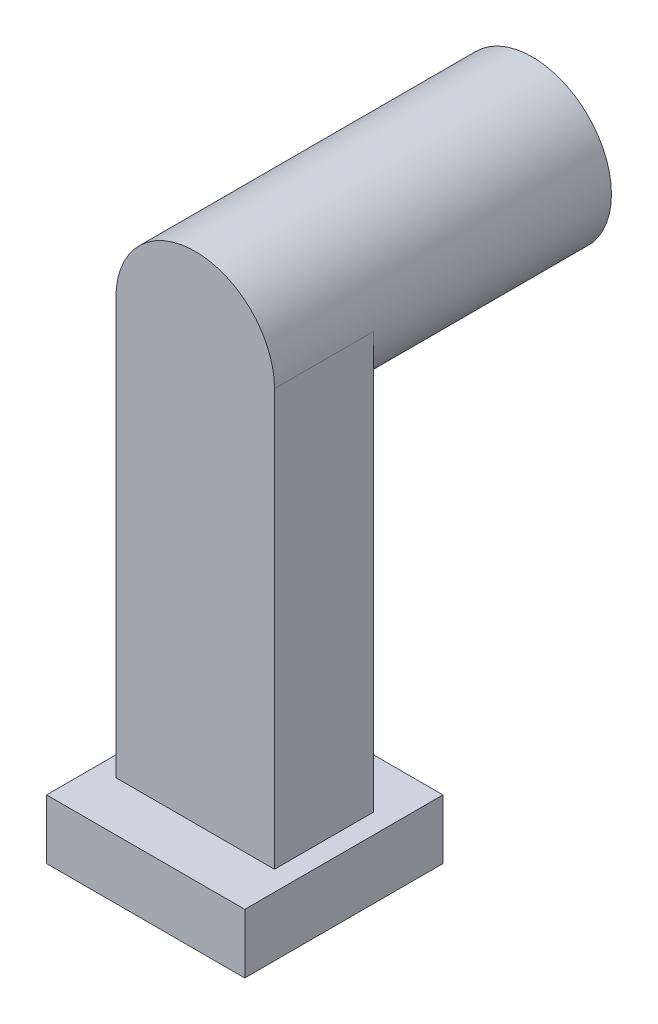
ISO-10303-21;
HEADER;
FILE_DESCRIPTION(('STEP AP214'),'2;1');
FILE_NAME('part.step','',(''),(''),'','','');
FILE_SCHEMA(('AUTOMOTIVE_DESIGN { 1 0 10303 214 1 1 1 1 }'));
ENDSEC;
DATA;
#1=APPLICATION_CONTEXT('core data for automotive mechanical design processes');
#2=APPLICATION_PROTOCOL_DEFINITION('international standard','automotive_design',2000,#1);
#3=PRODUCT_CONTEXT('',#1,'mechanical');
#4=PRODUCT('Part','Part','',(#3));
#5=PRODUCT_RELATED_PRODUCT_CATEGORY('part','',(#4));
#6=PRODUCT_DEFINITION_FORMATION('','',#4);
#7=PRODUCT_DEFINITION_CONTEXT('part definition',#1,'design');
#8=PRODUCT_DEFINITION('design','',#6,#7);
#9=PRODUCT_DEFINITION_SHAPE('','',#8);
#10=(LENGTH_UNIT() NAMED_UNIT(*) SI_UNIT(.MILLI.,.METRE.));
#11=(NAMED_UNIT(*) PLANE_ANGLE_UNIT() SI_UNIT($,.RADIAN.));
#12=(NAMED_UNIT(*) SI_UNIT($,.STERADIAN.) SOLID_ANGLE_UNIT());
#13=UNCERTAINTY_MEASURE_WITH_UNIT(LENGTH_MEASURE(1.E-05),#10,'distance_accuracy_value','');
#14=(GEOMETRIC_REPRESENTATION_CONTEXT(3) GLOBAL_UNCERTAINTY_ASSIGNED_CONTEXT((#13)) GLOBAL_UNIT_ASSIGNED_CONTEXT((#10,
#11,#12)) REPRESENTATION_CONTEXT('',''));
#15=CARTESIAN_POINT('',(0.,0.,0.));
#16=DIRECTION('',(0.,0.,1.));
#17=DIRECTION('',(1.,0.,0.));
#18=AXIS2_PLACEMENT_3D('',#15,#16,#17);
#19=CARTESIAN_POINT('',(0.,0.,30.));
#20=DIRECTION('',(0.,0.,-1.));
#21=DIRECTION('',(-1.,0.,0.));
#22=AXIS2_PLACEMENT_3D('',#19,#20,#21);
#23=CYLINDRICAL_SURFACE('',#22,4.);
#24=CARTESIAN_POINT('',(0.,0.,30.));
#25=DIRECTION('',(0.,0.,1.));
#26=DIRECTION('',(1.,0.,0.));
#27=AXIS2_PLACEMENT_3D('',#24,#25,#26);
#28=CIRCLE('',#27,4.);
#29=CARTESIAN_POINT('',(4.,0.,30.));
#30=VERTEX_POINT('',#29);
#31=CARTESIAN_POINT('',(-4.,0.,30.));
#32=VERTEX_POINT('',#31);
#33=EDGE_CURVE('E54',#30,#32,#28,.T.);
#34=ORIENTED_EDGE('',*,*,#33,.F.);
#35=DIRECTION('',(0.,0.,-1.));
#36=VECTOR('',#35,1.);
#37=CARTESIAN_POINT('',(4.,0.,25.));
#38=LINE('',#37,#36);
#39=CARTESIAN_POINT('',(4.,0.,25.));
#40=VERTEX_POINT('',#39);
#41=EDGE_CURVE('E96',#30,#40,#38,.T.);
#42=ORIENTED_EDGE('',*,*,#41,.T.);
#43=CARTESIAN_POINT('',(0.,0.,25.));
#44=DIRECTION('',(0.,0.,-1.));
#45=DIRECTION('',(-1.,0.,0.));
#46=AXIS2_PLACEMENT_3D('',#43,#44,#45);
#47=CIRCLE('',#46,4.);
#48=CARTESIAN_POINT('',(-4.,0.,25.));
#49=VERTEX_POINT('',#48);
#50=EDGE_CURVE('E11',#40,#49,#47,.T.);
#51=ORIENTED_EDGE('',*,*,#50,.T.);
#52=DIRECTION('',(0.,0.,1.));
#53=VECTOR('',#52,1.);
#54=CARTESIAN_POINT('',(-4.,0.,25.));
#55=LINE('',#54,#53);
#56=EDGE_CURVE('E105',#49,#32,#55,.T.);
#57=ORIENTED_EDGE('',*,*,#56,.T.);
#58=EDGE_LOOP('',(#34,#42,#51,#57));
#59=FACE_BOUND('',#58,.T.);
#60=CARTESIAN_POINT('',(0.,0.,13.));
#61=DIRECTION('',(0.,0.,1.));
#62=DIRECTION('',(1.,0.,0.));
#63=AXIS2_PLACEMENT_3D('',#60,#61,#62);
#64=CIRCLE('',#63,4.);
#65=CARTESIAN_POINT('',(4.,0.,13.));
#66=VERTEX_POINT('',#65);
#67=EDGE_CURVE('E116',#66,#66,#64,.T.);
#68=ORIENTED_EDGE('',*,*,#67,.T.);
#69=EDGE_LOOP('',(#68));
#70=FACE_BOUND('',#69,.T.);
#71=ADVANCED_FACE('F45',(#59,#70),#23,.T.);
#72=CARTESIAN_POINT('',(0.,0.,30.));
#73=DIRECTION('',(0.,0.,1.));
#74=DIRECTION('',(1.,0.,0.));
#75=AXIS2_PLACEMENT_3D('',#72,#73,#74);
#76=PLANE('',#75);
#77=ORIENTED_EDGE('',*,*,#33,.T.);
#78=DIRECTION('',(0.,1.,0.));
#79=VECTOR('',#78,1.);
#80=CARTESIAN_POINT('',(-4.,-21.,30.));
#81=LINE('',#80,#79);
#82=CARTESIAN_POINT('',(-4.,-21.,30.));
#83=VERTEX_POINT('',#82);
#84=EDGE_CURVE('E61',#83,#32,#81,.T.);
#85=ORIENTED_EDGE('',*,*,#84,.F.);
#86=DIRECTION('',(1.,0.,0.));
#87=VECTOR('',#86,1.);
#88=CARTESIAN_POINT('',(-4.,-21.,30.));
#89=LINE('',#88,#87);
#90=CARTESIAN_POINT('',(4.,-21.,30.));
#91=VERTEX_POINT('',#90);
#92=EDGE_CURVE('E109',#83,#91,#89,.T.);
#93=ORIENTED_EDGE('',*,*,#92,.T.);
#94=DIRECTION('',(0.,1.,0.));
#95=VECTOR('',#94,1.);
#96=CARTESIAN_POINT('',(4.,-21.,30.));
#97=LINE('',#96,#95);
#98=EDGE_CURVE('E99',#91,#30,#97,.T.);
#99=ORIENTED_EDGE('',*,*,#98,.T.);
#100=EDGE_LOOP('',(#77,#85,#93,#99));
#101=FACE_BOUND('',#100,.T.);
#102=ADVANCED_FACE('F130',(#101),#76,.T.);
#103=CARTESIAN_POINT('',(0.,0.,13.));
#104=DIRECTION('',(0.,0.,1.));
#105=DIRECTION('',(1.,0.,0.));
#106=AXIS2_PLACEMENT_3D('',#103,#104,#105);
#107=PLANE('',#106);
#108=ORIENTED_EDGE('',*,*,#67,.F.);
#109=EDGE_LOOP('',(#108));
#110=FACE_BOUND('',#109,.T.);
#111=ADVANCED_FACE('F47',(#110),#107,.F.);
#112=CARTESIAN_POINT('',(-4.,-21.,25.));
#113=DIRECTION('',(-1.,0.,0.));
#114=DIRECTION('',(0.,0.,1.));
#115=AXIS2_PLACEMENT_3D('',#112,#113,#114);
#116=PLANE('',#115);
#117=ORIENTED_EDGE('',*,*,#56,.F.);
#118=DIRECTION('',(0.,1.,0.));
#119=VECTOR('',#118,1.);
#120=CARTESIAN_POINT('',(-4.,-21.,25.));
#121=LINE('',#120,#119);
#122=CARTESIAN_POINT('',(-4.,-21.,25.));
#123=VERTEX_POINT('',#122);
#124=EDGE_CURVE('E90',#123,#49,#121,.T.);
#125=ORIENTED_EDGE('',*,*,#124,.F.);
#126=DIRECTION('',(0.,0.,1.));
#127=VECTOR('',#126,1.);
#128=CARTESIAN_POINT('',(-4.,-21.,25.));
#129=LINE('',#128,#127);
#130=EDGE_CURVE('E104',#123,#83,#129,.T.);
#131=ORIENTED_EDGE('',*,*,#130,.T.);
#132=ORIENTED_EDGE('',*,*,#84,.T.);
#133=EDGE_LOOP('',(#117,#125,#131,#132));
#134=FACE_BOUND('',#133,.T.);
#135=ADVANCED_FACE('F129',(#134),#116,.T.);
#136=CARTESIAN_POINT('',(-4.,-21.,25.));
#137=DIRECTION('',(0.,0.,-1.));
#138=DIRECTION('',(-1.,0.,0.));
#139=AXIS2_PLACEMENT_3D('',#136,#137,#138);
#140=PLANE('',#139);
#141=ORIENTED_EDGE('',*,*,#50,.F.);
#142=DIRECTION('',(0.,1.,0.));
#143=VECTOR('',#142,1.);
#144=CARTESIAN_POINT('',(4.,-21.,25.));
#145=LINE('',#144,#143);
#146=CARTESIAN_POINT('',(4.,-21.,25.));
#147=VERTEX_POINT('',#146);
#148=EDGE_CURVE('E88',#147,#40,#145,.T.);
#149=ORIENTED_EDGE('',*,*,#148,.F.);
#150=DIRECTION('',(-1.,0.,0.));
#151=VECTOR('',#150,1.);
#152=CARTESIAN_POINT('',(-4.,-21.,25.));
#153=LINE('',#152,#151);
#154=EDGE_CURVE('E122',#147,#123,#153,.T.);
#155=ORIENTED_EDGE('',*,*,#154,.T.);
#156=ORIENTED_EDGE('',*,*,#124,.T.);
#157=EDGE_LOOP('',(#141,#149,#155,#156));
#158=FACE_BOUND('',#157,.T.);
#159=ADVANCED_FACE('F85',(#158),#140,.T.);
#160=CARTESIAN_POINT('',(4.,-21.,25.));
#161=DIRECTION('',(1.,0.,0.));
#162=DIRECTION('',(0.,0.,-1.));
#163=AXIS2_PLACEMENT_3D('',#160,#161,#162);
#164=PLANE('',#163);
#165=ORIENTED_EDGE('',*,*,#41,.F.);
#166=ORIENTED_EDGE('',*,*,#98,.F.);
#167=DIRECTION('',(0.,0.,-1.));
#168=VECTOR('',#167,1.);
#169=CARTESIAN_POINT('',(4.,-21.,25.));
#170=LINE('',#169,#168);
#171=EDGE_CURVE('E70',#91,#147,#170,.T.);
#172=ORIENTED_EDGE('',*,*,#171,.T.);
#173=ORIENTED_EDGE('',*,*,#148,.T.);
#174=EDGE_LOOP('',(#165,#166,#172,#173));
#175=FACE_BOUND('',#174,.T.);
#176=ADVANCED_FACE('F95',(#175),#164,.T.);
#177=CARTESIAN_POINT('',(0.,-21.,0.));
#178=DIRECTION('',(0.,1.,0.));
#179=DIRECTION('',(0.,0.,1.));
#180=AXIS2_PLACEMENT_3D('',#177,#178,#179);
#181=PLANE('',#180);
#182=DIRECTION('',(0.,0.,1.));
#183=VECTOR('',#182,1.);
#184=CARTESIAN_POINT('',(5.,-21.,32.5));
#185=LINE('',#184,#183);
#186=CARTESIAN_POINT('',(5.,-21.,22.5));
#187=VERTEX_POINT('',#186);
#188=CARTESIAN_POINT('',(5.,-21.,32.5));
#189=VERTEX_POINT('',#188);
#190=EDGE_CURVE('E197',#187,#189,#185,.T.);
#191=ORIENTED_EDGE('',*,*,#190,.F.);
#192=DIRECTION('',(1.,0.,0.));
#193=VECTOR('',#192,1.);
#194=CARTESIAN_POINT('',(5.,-21.,22.5));
#195=LINE('',#194,#193);
#196=CARTESIAN_POINT('',(-5.,-21.,22.5));
#197=VERTEX_POINT('',#196);
#198=EDGE_CURVE('E191',#197,#187,#195,.T.);
#199=ORIENTED_EDGE('',*,*,#198,.F.);
#200=DIRECTION('',(0.,0.,-1.));
#201=VECTOR('',#200,1.);
#202=CARTESIAN_POINT('',(-5.,-21.,32.5));
#203=LINE('',#202,#201);
#204=CARTESIAN_POINT('',(-5.,-21.,32.5));
#205=VERTEX_POINT('',#204);
#206=EDGE_CURVE('E236',#205,#197,#203,.T.);
#207=ORIENTED_EDGE('',*,*,#206,.F.);
#208=DIRECTION('',(-1.,0.,0.));
#209=VECTOR('',#208,1.);
#210=CARTESIAN_POINT('',(5.,-21.,32.5));
#211=LINE('',#210,#209);
#212=EDGE_CURVE('E248',#189,#205,#211,.T.);
#213=ORIENTED_EDGE('',*,*,#212,.F.);
#214=EDGE_LOOP('',(#191,#199,#207,#213));
#215=FACE_BOUND('',#214,.T.);
#216=ORIENTED_EDGE('',*,*,#130,.F.);
#217=ORIENTED_EDGE('',*,*,#154,.F.);
#218=ORIENTED_EDGE('',*,*,#171,.F.);
#219=ORIENTED_EDGE('',*,*,#92,.F.);
#220=EDGE_LOOP('',(#216,#217,#218,#219));
#221=FACE_BOUND('',#220,.T.);
#222=ADVANCED_FACE('F144',(#215,#221),#181,.T.);
#223=CARTESIAN_POINT('',(5.,-24.,32.5));
#224=DIRECTION('',(-1.,0.,0.));
#225=DIRECTION('',(0.,0.,1.));
#226=AXIS2_PLACEMENT_3D('',#223,#224,#225);
#227=PLANE('',#226);
#228=ORIENTED_EDGE('',*,*,#190,.T.);
#229=DIRECTION('',(0.,1.,0.));
#230=VECTOR('',#229,1.);
#231=CARTESIAN_POINT('',(5.,-24.,32.5));
#232=LINE('',#231,#230);
#233=CARTESIAN_POINT('',(5.,-24.,32.5));
#234=VERTEX_POINT('',#233);
#235=EDGE_CURVE('E111',#234,#189,#232,.T.);
#236=ORIENTED_EDGE('',*,*,#235,.F.);
#237=DIRECTION('',(0.,0.,1.));
#238=VECTOR('',#237,1.);
#239=CARTESIAN_POINT('',(5.,-24.,32.5));
#240=LINE('',#239,#238);
#241=CARTESIAN_POINT('',(5.,-24.,22.5));
#242=VERTEX_POINT('',#241);
#243=EDGE_CURVE('E176',#242,#234,#240,.T.);
#244=ORIENTED_EDGE('',*,*,#243,.F.);
#245=DIRECTION('',(0.,1.,0.));
#246=VECTOR('',#245,1.);
#247=CARTESIAN_POINT('',(5.,-24.,22.5));
#248=LINE('',#247,#246);
#249=EDGE_CURVE('E239',#242,#187,#248,.T.);
#250=ORIENTED_EDGE('',*,*,#249,.T.);
#251=EDGE_LOOP('',(#228,#236,#244,#250));
#252=FACE_BOUND('',#251,.T.);
#253=ADVANCED_FACE('F147',(#252),#227,.F.);
#254=CARTESIAN_POINT('',(5.,-24.,32.5));
#255=DIRECTION('',(0.,0.,-1.));
#256=DIRECTION('',(-1.,0.,0.));
#257=AXIS2_PLACEMENT_3D('',#254,#255,#256);
#258=PLANE('',#257);
#259=ORIENTED_EDGE('',*,*,#212,.T.);
#260=DIRECTION('',(0.,1.,0.));
#261=VECTOR('',#260,1.);
#262=CARTESIAN_POINT('',(-5.,-24.,32.5));
#263=LINE('',#262,#261);
#264=CARTESIAN_POINT('',(-5.,-24.,32.5));
#265=VERTEX_POINT('',#264);
#266=EDGE_CURVE('E200',#265,#205,#263,.T.);
#267=ORIENTED_EDGE('',*,*,#266,.F.);
#268=DIRECTION('',(-1.,0.,0.));
#269=VECTOR('',#268,1.);
#270=CARTESIAN_POINT('',(5.,-24.,32.5));
#271=LINE('',#270,#269);
#272=EDGE_CURVE('E181',#234,#265,#271,.T.);
#273=ORIENTED_EDGE('',*,*,#272,.F.);
#274=ORIENTED_EDGE('',*,*,#235,.T.);
#275=EDGE_LOOP('',(#259,#267,#273,#274));
#276=FACE_BOUND('',#275,.T.);
#277=ADVANCED_FACE('F150',(#276),#258,.F.);
#278=CARTESIAN_POINT('',(-5.,-24.,32.5));
#279=DIRECTION('',(1.,0.,0.));
#280=DIRECTION('',(0.,0.,-1.));
#281=AXIS2_PLACEMENT_3D('',#278,#279,#280);
#282=PLANE('',#281);
#283=ORIENTED_EDGE('',*,*,#206,.T.);
#284=DIRECTION('',(0.,1.,0.));
#285=VECTOR('',#284,1.);
#286=CARTESIAN_POINT('',(-5.,-24.,22.5));
#287=LINE('',#286,#285);
#288=CARTESIAN_POINT('',(-5.,-24.,22.5));
#289=VERTEX_POINT('',#288);
#290=EDGE_CURVE('E204',#289,#197,#287,.T.);
#291=ORIENTED_EDGE('',*,*,#290,.F.);
#292=DIRECTION('',(0.,0.,-1.));
#293=VECTOR('',#292,1.);
#294=CARTESIAN_POINT('',(-5.,-24.,32.5));
#295=LINE('',#294,#293);
#296=EDGE_CURVE('E230',#265,#289,#295,.T.);
#297=ORIENTED_EDGE('',*,*,#296,.F.);
#298=ORIENTED_EDGE('',*,*,#266,.T.);
#299=EDGE_LOOP('',(#283,#291,#297,#298));
#300=FACE_BOUND('',#299,.T.);
#301=ADVANCED_FACE('F154',(#300),#282,.F.);
#302=CARTESIAN_POINT('',(5.,-24.,22.5));
#303=DIRECTION('',(0.,0.,1.));
#304=DIRECTION('',(1.,0.,0.));
#305=AXIS2_PLACEMENT_3D('',#302,#303,#304);
#306=PLANE('',#305);
#307=ORIENTED_EDGE('',*,*,#198,.T.);
#308=ORIENTED_EDGE('',*,*,#249,.F.);
#309=DIRECTION('',(1.,0.,0.));
#310=VECTOR('',#309,1.);
#311=CARTESIAN_POINT('',(5.,-24.,22.5));
#312=LINE('',#311,#310);
#313=EDGE_CURVE('E185',#289,#242,#312,.T.);
#314=ORIENTED_EDGE('',*,*,#313,.F.);
#315=ORIENTED_EDGE('',*,*,#290,.T.);
#316=EDGE_LOOP('',(#307,#308,#314,#315));
#317=FACE_BOUND('',#316,.T.);
#318=ADVANCED_FACE('F158',(#317),#306,.F.);
#319=CARTESIAN_POINT('',(0.,-24.,0.));
#320=DIRECTION('',(0.,1.,0.));
#321=DIRECTION('',(0.,0.,1.));
#322=AXIS2_PLACEMENT_3D('',#319,#320,#321);
#323=PLANE('',#322);
#324=ORIENTED_EDGE('',*,*,#243,.T.);
#325=ORIENTED_EDGE('',*,*,#272,.T.);
#326=ORIENTED_EDGE('',*,*,#296,.T.);
#327=ORIENTED_EDGE('',*,*,#313,.T.);
#328=EDGE_LOOP('',(#324,#325,#326,#327));
#329=FACE_BOUND('',#328,.T.);
#330=ADVANCED_FACE('F162',(#329),#323,.F.);
#331=CLOSED_SHELL('',(#71,#102,#111,#135,#159,#176,#222,#253,#277,#301,#318,#330));
#332=MANIFOLD_SOLID_BREP('B2',#331);
#333=ADVANCED_BREP_SHAPE_REPRESENTATION('',(#18,#332),#14);
#334=SHAPE_DEFINITION_REPRESENTATION(#9,#333);
ENDSEC;
END-ISO-10303-21;
